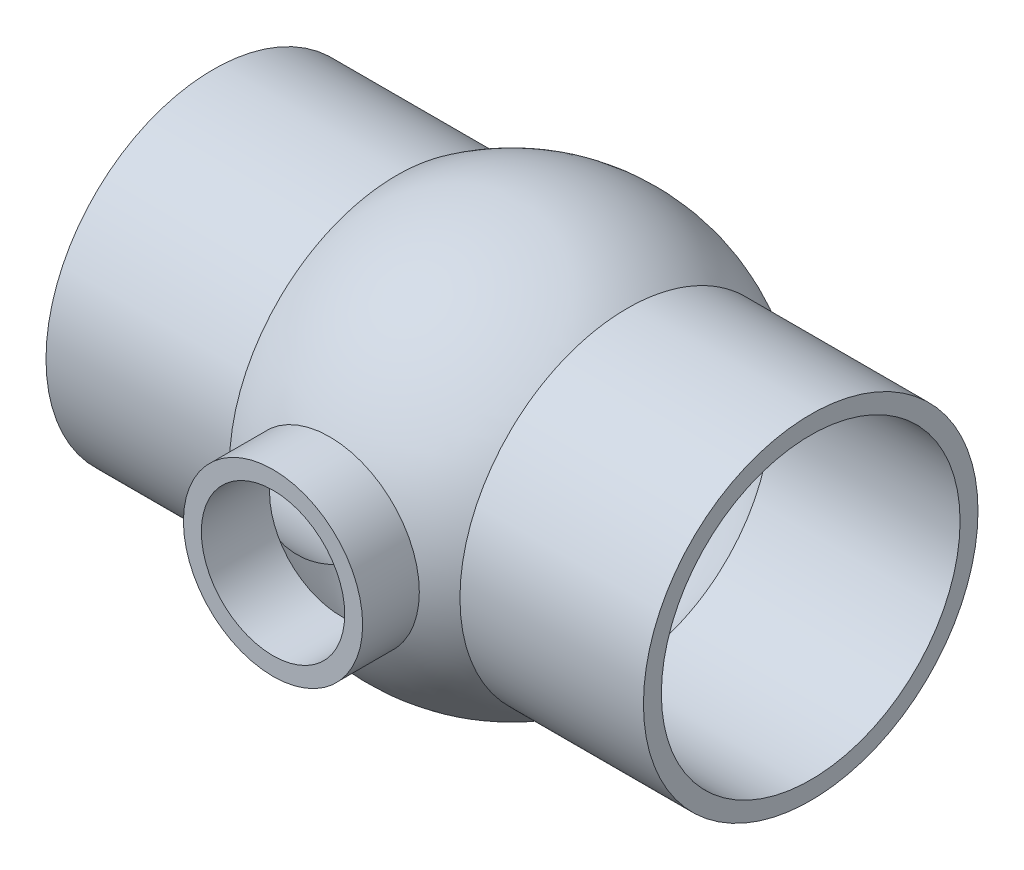
ISO-10303-21;
HEADER;
FILE_DESCRIPTION(('STEP AP214'),'2;1');
FILE_NAME('part.step','',(''),(''),'','','');
FILE_SCHEMA(('AUTOMOTIVE_DESIGN { 1 0 10303 214 1 1 1 1 }'));
ENDSEC;
DATA;
#1=APPLICATION_CONTEXT('core data for automotive mechanical design processes');
#2=APPLICATION_PROTOCOL_DEFINITION('international standard','automotive_design',2000,#1);
#3=PRODUCT_CONTEXT('',#1,'mechanical');
#4=PRODUCT('Part','Part','',(#3));
#5=PRODUCT_RELATED_PRODUCT_CATEGORY('part','',(#4));
#6=PRODUCT_DEFINITION_FORMATION('','',#4);
#7=PRODUCT_DEFINITION_CONTEXT('part definition',#1,'design');
#8=PRODUCT_DEFINITION('design','',#6,#7);
#9=PRODUCT_DEFINITION_SHAPE('','',#8);
#10=(LENGTH_UNIT() NAMED_UNIT(*) SI_UNIT(.MILLI.,.METRE.));
#11=(NAMED_UNIT(*) PLANE_ANGLE_UNIT() SI_UNIT($,.RADIAN.));
#12=(NAMED_UNIT(*) SI_UNIT($,.STERADIAN.) SOLID_ANGLE_UNIT());
#13=UNCERTAINTY_MEASURE_WITH_UNIT(LENGTH_MEASURE(1.E-05),#10,'distance_accuracy_value','');
#14=(GEOMETRIC_REPRESENTATION_CONTEXT(3) GLOBAL_UNCERTAINTY_ASSIGNED_CONTEXT((#13)) GLOBAL_UNIT_ASSIGNED_CONTEXT((#10,
#11,#12)) REPRESENTATION_CONTEXT('',''));
#15=CARTESIAN_POINT('',(0.,0.,0.));
#16=DIRECTION('',(0.,0.,1.));
#17=DIRECTION('',(1.,0.,0.));
#18=AXIS2_PLACEMENT_3D('',#15,#16,#17);
#19=CARTESIAN_POINT('',(540.000000000007,655.,0.));
#20=DIRECTION('',(0.,1.,0.));
#21=DIRECTION('',(0.,0.,-1.));
#22=AXIS2_PLACEMENT_3D('',#19,#20,#21);
#23=SPHERICAL_SURFACE('',#22,17.);
#24=CARTESIAN_POINT('',(530.356349239014,655.,0.));
#25=DIRECTION('',(0.999999999999997,0.,0.));
#26=DIRECTION('',(0.,0.,-1.));
#27=AXIS2_PLACEMENT_3D('',#24,#25,#26);
#28=CIRCLE('',#27,14.);
#29=CARTESIAN_POINT('',(530.356349239014,655.,-14.));
#30=VERTEX_POINT('',#29);
#31=EDGE_CURVE('E40',#30,#30,#28,.T.);
#32=ORIENTED_EDGE('',*,*,#31,.T.);
#33=EDGE_LOOP('',(#32));
#34=FACE_BOUND('',#33,.T.);
#35=CARTESIAN_POINT('',(549.643650761,655.,0.));
#36=DIRECTION('',(-0.999999999999997,0.,0.));
#37=DIRECTION('',(0.,0.,1.));
#38=AXIS2_PLACEMENT_3D('',#35,#36,#37);
#39=CIRCLE('',#38,14.);
#40=CARTESIAN_POINT('',(549.643650761,655.,14.));
#41=VERTEX_POINT('',#40);
#42=EDGE_CURVE('E10',#41,#41,#39,.T.);
#43=ORIENTED_EDGE('',*,*,#42,.T.);
#44=EDGE_LOOP('',(#43));
#45=FACE_BOUND('',#44,.T.);
#46=CARTESIAN_POINT('',(540.000000000007,655.,15.2561463023924));
#47=DIRECTION('',(0.,0.,-1.));
#48=DIRECTION('',(-1.,0.,0.));
#49=AXIS2_PLACEMENT_3D('',#46,#47,#48);
#50=CIRCLE('',#49,7.49999999999996);
#51=CARTESIAN_POINT('',(532.500000000007,655.,15.2561463023924));
#52=VERTEX_POINT('',#51);
#53=EDGE_CURVE('E36',#52,#52,#50,.T.);
#54=ORIENTED_EDGE('',*,*,#53,.T.);
#55=EDGE_LOOP('',(#54));
#56=FACE_BOUND('',#55,.T.);
#57=ADVANCED_FACE('F32',(#34,#45,#56),#23,.T.);
#58=CARTESIAN_POINT('',(515.000000000007,655.,0.));
#59=DIRECTION('',(1.,0.,0.));
#60=DIRECTION('',(0.,0.,-1.));
#61=AXIS2_PLACEMENT_3D('',#58,#59,#60);
#62=CYLINDRICAL_SURFACE('',#61,14.);
#63=ORIENTED_EDGE('',*,*,#42,.F.);
#64=EDGE_LOOP('',(#63));
#65=FACE_BOUND('',#64,.T.);
#66=CARTESIAN_POINT('',(565.000000000007,655.,0.));
#67=DIRECTION('',(1.,0.,0.));
#68=DIRECTION('',(0.,0.,-1.));
#69=AXIS2_PLACEMENT_3D('',#66,#67,#68);
#70=CIRCLE('',#69,14.);
#71=CARTESIAN_POINT('',(565.000000000007,655.,-14.));
#72=VERTEX_POINT('',#71);
#73=EDGE_CURVE('E47',#72,#72,#70,.T.);
#74=ORIENTED_EDGE('',*,*,#73,.F.);
#75=EDGE_LOOP('',(#74));
#76=FACE_BOUND('',#75,.T.);
#77=ADVANCED_FACE('F107',(#65,#76),#62,.T.);
#78=CARTESIAN_POINT('',(565.000000000007,0.,0.));
#79=DIRECTION('',(1.,0.,0.));
#80=DIRECTION('',(0.,0.,-1.));
#81=AXIS2_PLACEMENT_3D('',#78,#79,#80);
#82=PLANE('',#81);
#83=CARTESIAN_POINT('',(565.000000000007,655.,0.));
#84=DIRECTION('',(1.,0.,0.));
#85=DIRECTION('',(0.,0.,-1.));
#86=AXIS2_PLACEMENT_3D('',#83,#84,#85);
#87=CIRCLE('',#86,12.5);
#88=CARTESIAN_POINT('',(565.000000000007,655.,-12.5));
#89=VERTEX_POINT('',#88);
#90=EDGE_CURVE('E64',#89,#89,#87,.T.);
#91=ORIENTED_EDGE('',*,*,#90,.F.);
#92=EDGE_LOOP('',(#91));
#93=FACE_BOUND('',#92,.T.);
#94=ORIENTED_EDGE('',*,*,#73,.T.);
#95=EDGE_LOOP('',(#94));
#96=FACE_BOUND('',#95,.T.);
#97=ADVANCED_FACE('F115',(#93,#96),#82,.T.);
#98=CARTESIAN_POINT('',(515.000000000007,0.,0.));
#99=DIRECTION('',(1.,0.,0.));
#100=DIRECTION('',(0.,0.,-1.));
#101=AXIS2_PLACEMENT_3D('',#98,#99,#100);
#102=PLANE('',#101);
#103=CARTESIAN_POINT('',(515.000000000007,655.,0.));
#104=DIRECTION('',(1.,0.,0.));
#105=DIRECTION('',(0.,0.,-1.));
#106=AXIS2_PLACEMENT_3D('',#103,#104,#105);
#107=CIRCLE('',#106,12.5);
#108=CARTESIAN_POINT('',(515.000000000007,655.,-12.5));
#109=VERTEX_POINT('',#108);
#110=EDGE_CURVE('E60',#109,#109,#107,.T.);
#111=ORIENTED_EDGE('',*,*,#110,.T.);
#112=EDGE_LOOP('',(#111));
#113=FACE_BOUND('',#112,.T.);
#114=CARTESIAN_POINT('',(515.000000000007,655.,0.));
#115=DIRECTION('',(1.,0.,0.));
#116=DIRECTION('',(0.,0.,-1.));
#117=AXIS2_PLACEMENT_3D('',#114,#115,#116);
#118=CIRCLE('',#117,14.);
#119=CARTESIAN_POINT('',(515.000000000007,655.,-14.));
#120=VERTEX_POINT('',#119);
#121=EDGE_CURVE('E44',#120,#120,#118,.T.);
#122=ORIENTED_EDGE('',*,*,#121,.F.);
#123=EDGE_LOOP('',(#122));
#124=FACE_BOUND('',#123,.T.);
#125=ADVANCED_FACE('F105',(#113,#124),#102,.F.);
#126=ORIENTED_EDGE('',*,*,#31,.F.);
#127=EDGE_LOOP('',(#126));
#128=FACE_BOUND('',#127,.T.);
#129=ORIENTED_EDGE('',*,*,#121,.T.);
#130=EDGE_LOOP('',(#129));
#131=FACE_BOUND('',#130,.T.);
#132=ADVANCED_FACE('F34',(#128,#131),#62,.T.);
#133=CARTESIAN_POINT('',(540.000000000007,655.,20.));
#134=DIRECTION('',(0.,0.,-1.));
#135=DIRECTION('',(-1.,0.,0.));
#136=AXIS2_PLACEMENT_3D('',#133,#134,#135);
#137=CYLINDRICAL_SURFACE('',#136,7.49999999999996);
#138=ORIENTED_EDGE('',*,*,#53,.F.);
#139=EDGE_LOOP('',(#138));
#140=FACE_BOUND('',#139,.T.);
#141=CARTESIAN_POINT('',(540.000000000007,655.,20.));
#142=DIRECTION('',(0.,0.,1.));
#143=DIRECTION('',(1.,0.,0.));
#144=AXIS2_PLACEMENT_3D('',#141,#142,#143);
#145=CIRCLE('',#144,7.49999999999996);
#146=CARTESIAN_POINT('',(547.500000000007,655.,20.));
#147=VERTEX_POINT('',#146);
#148=EDGE_CURVE('E52',#147,#147,#145,.T.);
#149=ORIENTED_EDGE('',*,*,#148,.F.);
#150=EDGE_LOOP('',(#149));
#151=FACE_BOUND('',#150,.T.);
#152=ADVANCED_FACE('F95',(#140,#151),#137,.T.);
#153=CARTESIAN_POINT('',(540.000000000007,655.,20.));
#154=DIRECTION('',(0.,0.,1.));
#155=DIRECTION('',(1.,0.,0.));
#156=AXIS2_PLACEMENT_3D('',#153,#154,#155);
#157=PLANE('',#156);
#158=CARTESIAN_POINT('',(540.000000000007,655.,20.));
#159=DIRECTION('',(0.,0.,1.));
#160=DIRECTION('',(1.,0.,0.));
#161=AXIS2_PLACEMENT_3D('',#158,#159,#160);
#162=CIRCLE('',#161,5.99999999999996);
#163=CARTESIAN_POINT('',(546.000000000007,655.,20.));
#164=VERTEX_POINT('',#163);
#165=EDGE_CURVE('E56',#164,#164,#162,.T.);
#166=ORIENTED_EDGE('',*,*,#165,.F.);
#167=EDGE_LOOP('',(#166));
#168=FACE_BOUND('',#167,.T.);
#169=ORIENTED_EDGE('',*,*,#148,.T.);
#170=EDGE_LOOP('',(#169));
#171=FACE_BOUND('',#170,.T.);
#172=ADVANCED_FACE('F81',(#168,#171),#157,.T.);
#173=CARTESIAN_POINT('',(540.000000000007,655.,0.));
#174=DIRECTION('',(0.,1.,0.));
#175=DIRECTION('',(0.,0.,-1.));
#176=AXIS2_PLACEMENT_3D('',#173,#174,#175);
#177=SPHERICAL_SURFACE('',#176,15.5);
#178=CARTESIAN_POINT('',(530.834848610095,655.,0.));
#179=DIRECTION('',(1.,0.,0.));
#180=DIRECTION('',(0.,0.,-1.));
#181=AXIS2_PLACEMENT_3D('',#178,#179,#180);
#182=CIRCLE('',#181,12.5);
#183=CARTESIAN_POINT('',(530.834848610095,655.,-12.5));
#184=VERTEX_POINT('',#183);
#185=EDGE_CURVE('E63',#184,#184,#182,.T.);
#186=ORIENTED_EDGE('',*,*,#185,.F.);
#187=EDGE_LOOP('',(#186));
#188=FACE_BOUND('',#187,.T.);
#189=CARTESIAN_POINT('',(549.165151389918,655.,0.));
#190=DIRECTION('',(-1.,0.,0.));
#191=DIRECTION('',(0.,0.,1.));
#192=AXIS2_PLACEMENT_3D('',#189,#190,#191);
#193=CIRCLE('',#192,12.5);
#194=CARTESIAN_POINT('',(549.165151389918,655.,12.5));
#195=VERTEX_POINT('',#194);
#196=EDGE_CURVE('E55',#195,#195,#193,.T.);
#197=ORIENTED_EDGE('',*,*,#196,.F.);
#198=EDGE_LOOP('',(#197));
#199=FACE_BOUND('',#198,.T.);
#200=CARTESIAN_POINT('',(540.000000000007,655.,14.2916059279565));
#201=DIRECTION('',(0.,0.,-1.));
#202=DIRECTION('',(-1.,0.,0.));
#203=AXIS2_PLACEMENT_3D('',#200,#201,#202);
#204=CIRCLE('',#203,5.99999999999996);
#205=CARTESIAN_POINT('',(534.000000000007,655.,14.2916059279565));
#206=VERTEX_POINT('',#205);
#207=EDGE_CURVE('E59',#206,#206,#204,.T.);
#208=ORIENTED_EDGE('',*,*,#207,.F.);
#209=EDGE_LOOP('',(#208));
#210=FACE_BOUND('',#209,.T.);
#211=ADVANCED_FACE('F77',(#188,#199,#210),#177,.F.);
#212=CARTESIAN_POINT('',(515.000000000007,655.,0.));
#213=DIRECTION('',(1.,0.,0.));
#214=DIRECTION('',(0.,0.,-1.));
#215=AXIS2_PLACEMENT_3D('',#212,#213,#214);
#216=CYLINDRICAL_SURFACE('',#215,12.5);
#217=ORIENTED_EDGE('',*,*,#196,.T.);
#218=EDGE_LOOP('',(#217));
#219=FACE_BOUND('',#218,.T.);
#220=ORIENTED_EDGE('',*,*,#90,.T.);
#221=EDGE_LOOP('',(#220));
#222=FACE_BOUND('',#221,.T.);
#223=ADVANCED_FACE('F80',(#219,#222),#216,.F.);
#224=ORIENTED_EDGE('',*,*,#185,.T.);
#225=EDGE_LOOP('',(#224));
#226=FACE_BOUND('',#225,.T.);
#227=ORIENTED_EDGE('',*,*,#110,.F.);
#228=EDGE_LOOP('',(#227));
#229=FACE_BOUND('',#228,.T.);
#230=ADVANCED_FACE('F74',(#226,#229),#216,.F.);
#231=CARTESIAN_POINT('',(540.000000000007,655.,20.));
#232=DIRECTION('',(0.,0.,-1.));
#233=DIRECTION('',(-1.,0.,0.));
#234=AXIS2_PLACEMENT_3D('',#231,#232,#233);
#235=CYLINDRICAL_SURFACE('',#234,5.99999999999996);
#236=ORIENTED_EDGE('',*,*,#207,.T.);
#237=EDGE_LOOP('',(#236));
#238=FACE_BOUND('',#237,.T.);
#239=ORIENTED_EDGE('',*,*,#165,.T.);
#240=EDGE_LOOP('',(#239));
#241=FACE_BOUND('',#240,.T.);
#242=ADVANCED_FACE('F87',(#238,#241),#235,.F.);
#243=CLOSED_SHELL('',(#57,#77,#97,#125,#132,#152,#172,#211,#223,#230,#242));
#244=MANIFOLD_SOLID_BREP('B2',#243);
#245=ADVANCED_BREP_SHAPE_REPRESENTATION('',(#18,#244),#14);
#246=SHAPE_DEFINITION_REPRESENTATION(#9,#245);
ENDSEC;
END-ISO-10303-21;
